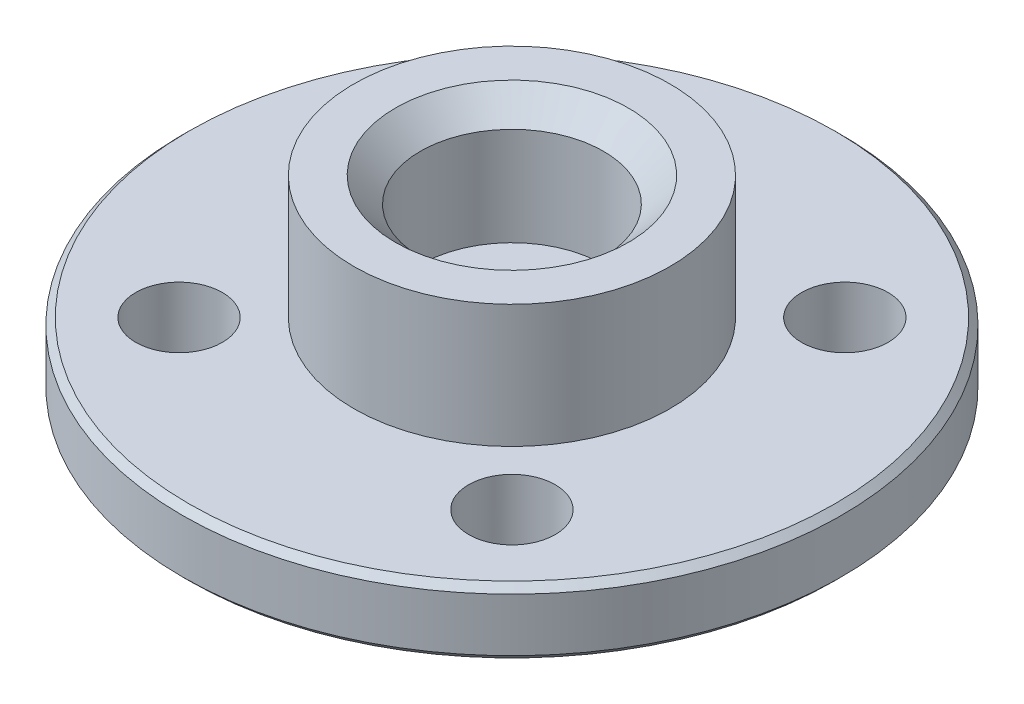
ISO-10303-21;
HEADER;
FILE_DESCRIPTION(('STEP AP214'),'2;1');
FILE_NAME('part.step','',(''),(''),'','','');
FILE_SCHEMA(('AUTOMOTIVE_DESIGN { 1 0 10303 214 1 1 1 1 }'));
ENDSEC;
DATA;
#1=APPLICATION_CONTEXT('core data for automotive mechanical design processes');
#2=APPLICATION_PROTOCOL_DEFINITION('international standard','automotive_design',2000,#1);
#3=PRODUCT_CONTEXT('',#1,'mechanical');
#4=PRODUCT('Part','Part','',(#3));
#5=PRODUCT_RELATED_PRODUCT_CATEGORY('part','',(#4));
#6=PRODUCT_DEFINITION_FORMATION('','',#4);
#7=PRODUCT_DEFINITION_CONTEXT('part definition',#1,'design');
#8=PRODUCT_DEFINITION('design','',#6,#7);
#9=PRODUCT_DEFINITION_SHAPE('','',#8);
#10=(LENGTH_UNIT() NAMED_UNIT(*) SI_UNIT(.MILLI.,.METRE.));
#11=(NAMED_UNIT(*) PLANE_ANGLE_UNIT() SI_UNIT($,.RADIAN.));
#12=(NAMED_UNIT(*) SI_UNIT($,.STERADIAN.) SOLID_ANGLE_UNIT());
#13=UNCERTAINTY_MEASURE_WITH_UNIT(LENGTH_MEASURE(1.E-05),#10,'distance_accuracy_value','');
#14=(GEOMETRIC_REPRESENTATION_CONTEXT(3) GLOBAL_UNCERTAINTY_ASSIGNED_CONTEXT((#13)) GLOBAL_UNIT_ASSIGNED_CONTEXT((#10,
#11,#12)) REPRESENTATION_CONTEXT('',''));
#15=CARTESIAN_POINT('',(0.,0.,0.));
#16=DIRECTION('',(0.,0.,1.));
#17=DIRECTION('',(1.,0.,0.));
#18=AXIS2_PLACEMENT_3D('',#15,#16,#17);
#19=CARTESIAN_POINT('',(0.,2.,0.));
#20=DIRECTION('',(0.,-1.,0.));
#21=DIRECTION('',(0.,0.,-1.));
#22=AXIS2_PLACEMENT_3D('',#19,#20,#21);
#23=CYLINDRICAL_SURFACE('',#22,9.9);
#24=CARTESIAN_POINT('',(0.,0.200000000000002,0.));
#25=DIRECTION('',(0.,1.,0.));
#26=DIRECTION('',(0.,0.,1.));
#27=AXIS2_PLACEMENT_3D('',#24,#25,#26);
#28=CIRCLE('',#27,9.9);
#29=CARTESIAN_POINT('',(0.,0.200000000000002,9.9));
#30=VERTEX_POINT('',#29);
#31=EDGE_CURVE('E58',#30,#30,#28,.T.);
#32=ORIENTED_EDGE('',*,*,#31,.T.);
#33=EDGE_LOOP('',(#32));
#34=FACE_BOUND('',#33,.T.);
#35=CARTESIAN_POINT('',(0.,1.80000000000001,0.));
#36=DIRECTION('',(0.,1.,0.));
#37=DIRECTION('',(0.,0.,1.));
#38=AXIS2_PLACEMENT_3D('',#35,#36,#37);
#39=CIRCLE('',#38,9.9);
#40=CARTESIAN_POINT('',(0.,1.80000000000001,9.9));
#41=VERTEX_POINT('',#40);
#42=EDGE_CURVE('E63',#41,#41,#39,.F.);
#43=ORIENTED_EDGE('',*,*,#42,.T.);
#44=EDGE_LOOP('',(#43));
#45=FACE_BOUND('',#44,.T.);
#46=ADVANCED_FACE('F44',(#34,#45),#23,.T.);
#47=CARTESIAN_POINT('',(0.,2.,0.));
#48=DIRECTION('',(0.,1.,0.));
#49=DIRECTION('',(0.,0.,1.));
#50=AXIS2_PLACEMENT_3D('',#47,#48,#49);
#51=PLANE('',#50);
#52=CARTESIAN_POINT('',(0.,2.,0.));
#53=DIRECTION('',(0.,1.,0.));
#54=DIRECTION('',(0.,0.,1.));
#55=AXIS2_PLACEMENT_3D('',#52,#53,#54);
#56=CIRCLE('',#55,9.70000000000001);
#57=CARTESIAN_POINT('',(0.,2.,9.70000000000001));
#58=VERTEX_POINT('',#57);
#59=EDGE_CURVE('E10',#58,#58,#56,.T.);
#60=ORIENTED_EDGE('',*,*,#59,.T.);
#61=EDGE_LOOP('',(#60));
#62=FACE_BOUND('',#61,.T.);
#63=CARTESIAN_POINT('',(5.,2.,5.));
#64=DIRECTION('',(0.,1.,0.));
#65=DIRECTION('',(0.,0.,1.));
#66=AXIS2_PLACEMENT_3D('',#63,#64,#65);
#67=CIRCLE('',#66,1.3);
#68=CARTESIAN_POINT('',(5.,2.,6.3));
#69=VERTEX_POINT('',#68);
#70=EDGE_CURVE('E94',#69,#69,#67,.F.);
#71=ORIENTED_EDGE('',*,*,#70,.T.);
#72=EDGE_LOOP('',(#71));
#73=FACE_BOUND('',#72,.T.);
#74=CARTESIAN_POINT('',(-5.,2.,-5.));
#75=DIRECTION('',(0.,1.,0.));
#76=DIRECTION('',(0.,0.,1.));
#77=AXIS2_PLACEMENT_3D('',#74,#75,#76);
#78=CIRCLE('',#77,1.3);
#79=CARTESIAN_POINT('',(-5.,2.,-3.7));
#80=VERTEX_POINT('',#79);
#81=EDGE_CURVE('E102',#80,#80,#78,.F.);
#82=ORIENTED_EDGE('',*,*,#81,.T.);
#83=EDGE_LOOP('',(#82));
#84=FACE_BOUND('',#83,.T.);
#85=CARTESIAN_POINT('',(5.,2.,-5.));
#86=DIRECTION('',(0.,1.,0.));
#87=DIRECTION('',(0.,0.,1.));
#88=AXIS2_PLACEMENT_3D('',#85,#86,#87);
#89=CIRCLE('',#88,1.3);
#90=CARTESIAN_POINT('',(5.,2.,-3.7));
#91=VERTEX_POINT('',#90);
#92=EDGE_CURVE('E103',#91,#91,#89,.F.);
#93=ORIENTED_EDGE('',*,*,#92,.T.);
#94=EDGE_LOOP('',(#93));
#95=FACE_BOUND('',#94,.T.);
#96=CARTESIAN_POINT('',(-5.,2.,5.));
#97=DIRECTION('',(0.,1.,0.));
#98=DIRECTION('',(0.,0.,1.));
#99=AXIS2_PLACEMENT_3D('',#96,#97,#98);
#100=CIRCLE('',#99,1.3);
#101=CARTESIAN_POINT('',(-5.,2.,6.3));
#102=VERTEX_POINT('',#101);
#103=EDGE_CURVE('E90',#102,#102,#100,.F.);
#104=ORIENTED_EDGE('',*,*,#103,.T.);
#105=EDGE_LOOP('',(#104));
#106=FACE_BOUND('',#105,.T.);
#107=CARTESIAN_POINT('',(0.,2.,0.));
#108=DIRECTION('',(0.,1.,0.));
#109=DIRECTION('',(0.,0.,1.));
#110=AXIS2_PLACEMENT_3D('',#107,#108,#109);
#111=CIRCLE('',#110,4.75);
#112=CARTESIAN_POINT('',(0.,2.,4.75));
#113=VERTEX_POINT('',#112);
#114=EDGE_CURVE('E82',#113,#113,#111,.T.);
#115=ORIENTED_EDGE('',*,*,#114,.F.);
#116=EDGE_LOOP('',(#115));
#117=FACE_BOUND('',#116,.T.);
#118=ADVANCED_FACE('F130',(#62,#73,#84,#95,#106,#117),#51,.T.);
#119=CARTESIAN_POINT('',(0.,0.,0.));
#120=DIRECTION('',(0.,1.,0.));
#121=DIRECTION('',(0.,0.,1.));
#122=AXIS2_PLACEMENT_3D('',#119,#120,#121);
#123=PLANE('',#122);
#124=CARTESIAN_POINT('',(0.,0.,0.));
#125=DIRECTION('',(0.,1.,0.));
#126=DIRECTION('',(0.,0.,1.));
#127=AXIS2_PLACEMENT_3D('',#124,#125,#126);
#128=CIRCLE('',#127,9.7);
#129=CARTESIAN_POINT('',(0.,0.,9.7));
#130=VERTEX_POINT('',#129);
#131=EDGE_CURVE('E53',#130,#130,#128,.F.);
#132=ORIENTED_EDGE('',*,*,#131,.T.);
#133=EDGE_LOOP('',(#132));
#134=FACE_BOUND('',#133,.T.);
#135=CARTESIAN_POINT('',(5.,0.,5.));
#136=DIRECTION('',(0.,-1.,0.));
#137=DIRECTION('',(0.,0.,-1.));
#138=AXIS2_PLACEMENT_3D('',#135,#136,#137);
#139=CIRCLE('',#138,1.3);
#140=CARTESIAN_POINT('',(5.,0.,3.7));
#141=VERTEX_POINT('',#140);
#142=EDGE_CURVE('E107',#141,#141,#139,.T.);
#143=ORIENTED_EDGE('',*,*,#142,.F.);
#144=EDGE_LOOP('',(#143));
#145=FACE_BOUND('',#144,.T.);
#146=CARTESIAN_POINT('',(-5.,0.,-5.));
#147=DIRECTION('',(0.,-1.,0.));
#148=DIRECTION('',(0.,0.,-1.));
#149=AXIS2_PLACEMENT_3D('',#146,#147,#148);
#150=CIRCLE('',#149,1.3);
#151=CARTESIAN_POINT('',(-5.,0.,-6.3));
#152=VERTEX_POINT('',#151);
#153=EDGE_CURVE('E98',#152,#152,#150,.T.);
#154=ORIENTED_EDGE('',*,*,#153,.F.);
#155=EDGE_LOOP('',(#154));
#156=FACE_BOUND('',#155,.T.);
#157=CARTESIAN_POINT('',(5.,0.,-5.));
#158=DIRECTION('',(0.,-1.,0.));
#159=DIRECTION('',(0.,0.,-1.));
#160=AXIS2_PLACEMENT_3D('',#157,#158,#159);
#161=CIRCLE('',#160,1.3);
#162=CARTESIAN_POINT('',(5.,0.,-6.3));
#163=VERTEX_POINT('',#162);
#164=EDGE_CURVE('E122',#163,#163,#161,.T.);
#165=ORIENTED_EDGE('',*,*,#164,.F.);
#166=EDGE_LOOP('',(#165));
#167=FACE_BOUND('',#166,.T.);
#168=CARTESIAN_POINT('',(0.,0.,0.));
#169=DIRECTION('',(0.,-1.,0.));
#170=DIRECTION('',(0.,0.,-1.));
#171=AXIS2_PLACEMENT_3D('',#168,#169,#170);
#172=CIRCLE('',#171,1.45);
#173=CARTESIAN_POINT('',(0.,0.,-1.45));
#174=VERTEX_POINT('',#173);
#175=EDGE_CURVE('E114',#174,#174,#172,.T.);
#176=ORIENTED_EDGE('',*,*,#175,.F.);
#177=EDGE_LOOP('',(#176));
#178=FACE_BOUND('',#177,.T.);
#179=CARTESIAN_POINT('',(-5.,0.,5.));
#180=DIRECTION('',(0.,-1.,0.));
#181=DIRECTION('',(0.,0.,-1.));
#182=AXIS2_PLACEMENT_3D('',#179,#180,#181);
#183=CIRCLE('',#182,1.3);
#184=CARTESIAN_POINT('',(-5.,0.,3.7));
#185=VERTEX_POINT('',#184);
#186=EDGE_CURVE('E86',#185,#185,#183,.T.);
#187=ORIENTED_EDGE('',*,*,#186,.F.);
#188=EDGE_LOOP('',(#187));
#189=FACE_BOUND('',#188,.T.);
#190=ADVANCED_FACE('F141',(#134,#145,#156,#167,#178,#189),#123,.F.);
#191=CARTESIAN_POINT('',(0.,5.7,0.));
#192=DIRECTION('',(0.,1.,0.));
#193=DIRECTION('',(0.,0.,1.));
#194=AXIS2_PLACEMENT_3D('',#191,#192,#193);
#195=PLANE('',#194);
#196=CARTESIAN_POINT('',(0.,5.7,0.));
#197=DIRECTION('',(0.,1.,0.));
#198=DIRECTION('',(0.,0.,1.));
#199=AXIS2_PLACEMENT_3D('',#196,#197,#198);
#200=CIRCLE('',#199,3.50000000000001);
#201=CARTESIAN_POINT('',(0.,5.7,3.50000000000001));
#202=VERTEX_POINT('',#201);
#203=EDGE_CURVE('E69',#202,#202,#200,.F.);
#204=ORIENTED_EDGE('',*,*,#203,.T.);
#205=EDGE_LOOP('',(#204));
#206=FACE_BOUND('',#205,.T.);
#207=CARTESIAN_POINT('',(0.,5.7,0.));
#208=DIRECTION('',(0.,1.,0.));
#209=DIRECTION('',(0.,0.,1.));
#210=AXIS2_PLACEMENT_3D('',#207,#208,#209);
#211=CIRCLE('',#210,4.75);
#212=CARTESIAN_POINT('',(0.,5.7,4.75));
#213=VERTEX_POINT('',#212);
#214=EDGE_CURVE('E81',#213,#213,#211,.T.);
#215=ORIENTED_EDGE('',*,*,#214,.T.);
#216=EDGE_LOOP('',(#215));
#217=FACE_BOUND('',#216,.T.);
#218=ADVANCED_FACE('F144',(#206,#217),#195,.T.);
#219=CARTESIAN_POINT('',(0.,5.7,0.));
#220=DIRECTION('',(0.,-1.,0.));
#221=DIRECTION('',(0.,0.,-1.));
#222=AXIS2_PLACEMENT_3D('',#219,#220,#221);
#223=CYLINDRICAL_SURFACE('',#222,4.75);
#224=ORIENTED_EDGE('',*,*,#214,.F.);
#225=EDGE_LOOP('',(#224));
#226=FACE_BOUND('',#225,.T.);
#227=ORIENTED_EDGE('',*,*,#114,.T.);
#228=EDGE_LOOP('',(#227));
#229=FACE_BOUND('',#228,.T.);
#230=ADVANCED_FACE('F252',(#226,#229),#223,.T.);
#231=CARTESIAN_POINT('',(0.,5.7,0.));
#232=DIRECTION('',(0.,-1.,0.));
#233=DIRECTION('',(0.,0.,-1.));
#234=AXIS2_PLACEMENT_3D('',#231,#232,#233);
#235=CYLINDRICAL_SURFACE('',#234,2.75);
#236=CARTESIAN_POINT('',(0.,4.95,0.));
#237=DIRECTION('',(0.,1.,0.));
#238=DIRECTION('',(0.,0.,1.));
#239=AXIS2_PLACEMENT_3D('',#236,#237,#238);
#240=CIRCLE('',#239,2.75);
#241=CARTESIAN_POINT('',(0.,4.95,2.75));
#242=VERTEX_POINT('',#241);
#243=EDGE_CURVE('E73',#242,#242,#240,.T.);
#244=ORIENTED_EDGE('',*,*,#243,.T.);
#245=EDGE_LOOP('',(#244));
#246=FACE_BOUND('',#245,.T.);
#247=CARTESIAN_POINT('',(0.,2.,0.));
#248=DIRECTION('',(0.,1.,0.));
#249=DIRECTION('',(0.,0.,1.));
#250=AXIS2_PLACEMENT_3D('',#247,#248,#249);
#251=CIRCLE('',#250,2.75);
#252=CARTESIAN_POINT('',(0.,2.,2.75));
#253=VERTEX_POINT('',#252);
#254=EDGE_CURVE('E77',#253,#253,#251,.F.);
#255=ORIENTED_EDGE('',*,*,#254,.T.);
#256=EDGE_LOOP('',(#255));
#257=FACE_BOUND('',#256,.T.);
#258=ADVANCED_FACE('F161',(#246,#257),#235,.F.);
#259=CARTESIAN_POINT('',(0.,2.,0.));
#260=DIRECTION('',(0.,1.,0.));
#261=DIRECTION('',(0.,0.,1.));
#262=AXIS2_PLACEMENT_3D('',#259,#260,#261);
#263=CIRCLE('',#262,1.45);
#264=CARTESIAN_POINT('',(0.,2.,1.45));
#265=VERTEX_POINT('',#264);
#266=EDGE_CURVE('E118',#265,#265,#263,.F.);
#267=ORIENTED_EDGE('',*,*,#266,.T.);
#268=EDGE_LOOP('',(#267));
#269=FACE_BOUND('',#268,.T.);
#270=ORIENTED_EDGE('',*,*,#254,.F.);
#271=EDGE_LOOP('',(#270));
#272=FACE_BOUND('',#271,.T.);
#273=ADVANCED_FACE('F152',(#269,#272),#51,.T.);
#274=CARTESIAN_POINT('',(-5.,5.701,5.));
#275=DIRECTION('',(0.,-1.,0.));
#276=DIRECTION('',(0.,0.,-1.));
#277=AXIS2_PLACEMENT_3D('',#274,#275,#276);
#278=CYLINDRICAL_SURFACE('',#277,1.3);
#279=ORIENTED_EDGE('',*,*,#103,.F.);
#280=EDGE_LOOP('',(#279));
#281=FACE_BOUND('',#280,.T.);
#282=ORIENTED_EDGE('',*,*,#186,.T.);
#283=EDGE_LOOP('',(#282));
#284=FACE_BOUND('',#283,.T.);
#285=ADVANCED_FACE('F150',(#281,#284),#278,.F.);
#286=CARTESIAN_POINT('',(0.,5.701,0.));
#287=DIRECTION('',(0.,-1.,0.));
#288=DIRECTION('',(0.,0.,-1.));
#289=AXIS2_PLACEMENT_3D('',#286,#287,#288);
#290=CYLINDRICAL_SURFACE('',#289,1.45);
#291=ORIENTED_EDGE('',*,*,#266,.F.);
#292=EDGE_LOOP('',(#291));
#293=FACE_BOUND('',#292,.T.);
#294=ORIENTED_EDGE('',*,*,#175,.T.);
#295=EDGE_LOOP('',(#294));
#296=FACE_BOUND('',#295,.T.);
#297=ADVANCED_FACE('F137',(#293,#296),#290,.F.);
#298=CARTESIAN_POINT('',(5.,5.701,-5.));
#299=DIRECTION('',(0.,-1.,0.));
#300=DIRECTION('',(0.,0.,-1.));
#301=AXIS2_PLACEMENT_3D('',#298,#299,#300);
#302=CYLINDRICAL_SURFACE('',#301,1.3);
#303=ORIENTED_EDGE('',*,*,#92,.F.);
#304=EDGE_LOOP('',(#303));
#305=FACE_BOUND('',#304,.T.);
#306=ORIENTED_EDGE('',*,*,#164,.T.);
#307=EDGE_LOOP('',(#306));
#308=FACE_BOUND('',#307,.T.);
#309=ADVANCED_FACE('F133',(#305,#308),#302,.F.);
#310=CARTESIAN_POINT('',(-5.,5.701,-5.));
#311=DIRECTION('',(0.,-1.,0.));
#312=DIRECTION('',(0.,0.,-1.));
#313=AXIS2_PLACEMENT_3D('',#310,#311,#312);
#314=CYLINDRICAL_SURFACE('',#313,1.3);
#315=ORIENTED_EDGE('',*,*,#81,.F.);
#316=EDGE_LOOP('',(#315));
#317=FACE_BOUND('',#316,.T.);
#318=ORIENTED_EDGE('',*,*,#153,.T.);
#319=EDGE_LOOP('',(#318));
#320=FACE_BOUND('',#319,.T.);
#321=ADVANCED_FACE('F136',(#317,#320),#314,.F.);
#322=CARTESIAN_POINT('',(5.,5.701,5.));
#323=DIRECTION('',(0.,-1.,0.));
#324=DIRECTION('',(0.,0.,-1.));
#325=AXIS2_PLACEMENT_3D('',#322,#323,#324);
#326=CYLINDRICAL_SURFACE('',#325,1.3);
#327=ORIENTED_EDGE('',*,*,#70,.F.);
#328=EDGE_LOOP('',(#327));
#329=FACE_BOUND('',#328,.T.);
#330=ORIENTED_EDGE('',*,*,#142,.T.);
#331=EDGE_LOOP('',(#330));
#332=FACE_BOUND('',#331,.T.);
#333=ADVANCED_FACE('F182',(#329,#332),#326,.F.);
#334=CARTESIAN_POINT('',(0.,4.95,0.));
#335=DIRECTION('',(0.,1.,0.));
#336=DIRECTION('',(0.,0.,1.));
#337=AXIS2_PLACEMENT_3D('',#334,#335,#336);
#338=CONICAL_SURFACE('',#337,2.75,0.785398163397451);
#339=ORIENTED_EDGE('',*,*,#203,.F.);
#340=EDGE_LOOP('',(#339));
#341=FACE_BOUND('',#340,.T.);
#342=ORIENTED_EDGE('',*,*,#243,.F.);
#343=EDGE_LOOP('',(#342));
#344=FACE_BOUND('',#343,.T.);
#345=ADVANCED_FACE('F177',(#341,#344),#338,.F.);
#346=CARTESIAN_POINT('',(0.,0.200000000000002,0.));
#347=DIRECTION('',(0.,1.,0.));
#348=DIRECTION('',(0.,0.,1.));
#349=AXIS2_PLACEMENT_3D('',#346,#347,#348);
#350=CONICAL_SURFACE('',#349,9.9,0.785398163397453);
#351=ORIENTED_EDGE('',*,*,#131,.F.);
#352=EDGE_LOOP('',(#351));
#353=FACE_BOUND('',#352,.T.);
#354=ORIENTED_EDGE('',*,*,#31,.F.);
#355=EDGE_LOOP('',(#354));
#356=FACE_BOUND('',#355,.T.);
#357=ADVANCED_FACE('F181',(#353,#356),#350,.T.);
#358=CARTESIAN_POINT('',(0.,2.,0.));
#359=DIRECTION('',(0.,-1.,0.));
#360=DIRECTION('',(0.,0.,-1.));
#361=AXIS2_PLACEMENT_3D('',#358,#359,#360);
#362=CONICAL_SURFACE('',#361,9.70000000000001,0.785398163397453);
#363=ORIENTED_EDGE('',*,*,#42,.F.);
#364=EDGE_LOOP('',(#363));
#365=FACE_BOUND('',#364,.T.);
#366=ORIENTED_EDGE('',*,*,#59,.F.);
#367=EDGE_LOOP('',(#366));
#368=FACE_BOUND('',#367,.T.);
#369=ADVANCED_FACE('F47',(#365,#368),#362,.T.);
#370=CLOSED_SHELL('',(#46,#118,#190,#218,#230,#258,#273,#285,#297,#309,#321,#333,#345,#357,#369));
#371=MANIFOLD_SOLID_BREP('B2',#370);
#372=ADVANCED_BREP_SHAPE_REPRESENTATION('',(#18,#371),#14);
#373=SHAPE_DEFINITION_REPRESENTATION(#9,#372);
ENDSEC;
END-ISO-10303-21;
